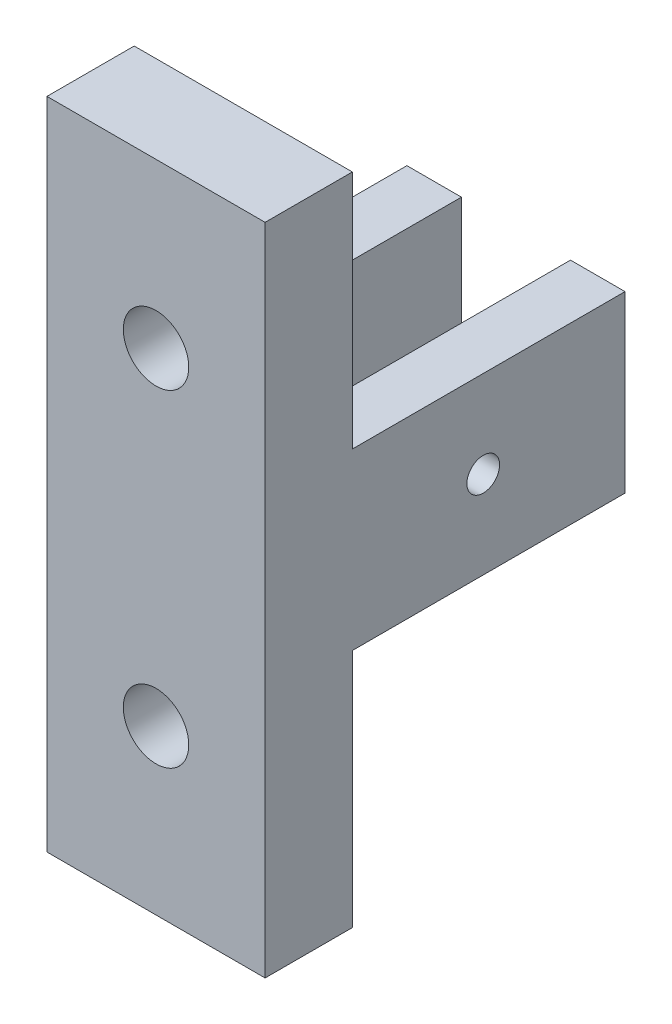
ISO-10303-21;
HEADER;
FILE_DESCRIPTION(('STEP AP214'),'2;1');
FILE_NAME('part.step','',(''),(''),'','','');
FILE_SCHEMA(('AUTOMOTIVE_DESIGN { 1 0 10303 214 1 1 1 1 }'));
ENDSEC;
DATA;
#1=APPLICATION_CONTEXT('core data for automotive mechanical design processes');
#2=APPLICATION_PROTOCOL_DEFINITION('international standard','automotive_design',2000,#1);
#3=PRODUCT_CONTEXT('',#1,'mechanical');
#4=PRODUCT('Part','Part','',(#3));
#5=PRODUCT_RELATED_PRODUCT_CATEGORY('part','',(#4));
#6=PRODUCT_DEFINITION_FORMATION('','',#4);
#7=PRODUCT_DEFINITION_CONTEXT('part definition',#1,'design');
#8=PRODUCT_DEFINITION('design','',#6,#7);
#9=PRODUCT_DEFINITION_SHAPE('','',#8);
#10=(LENGTH_UNIT() NAMED_UNIT(*) SI_UNIT(.MILLI.,.METRE.));
#11=(NAMED_UNIT(*) PLANE_ANGLE_UNIT() SI_UNIT($,.RADIAN.));
#12=(NAMED_UNIT(*) SI_UNIT($,.STERADIAN.) SOLID_ANGLE_UNIT());
#13=UNCERTAINTY_MEASURE_WITH_UNIT(LENGTH_MEASURE(1.E-05),#10,'distance_accuracy_value','');
#14=(GEOMETRIC_REPRESENTATION_CONTEXT(3) GLOBAL_UNCERTAINTY_ASSIGNED_CONTEXT((#13)) GLOBAL_UNIT_ASSIGNED_CONTEXT((#10,
#11,#12)) REPRESENTATION_CONTEXT('',''));
#15=CARTESIAN_POINT('',(0.,0.,0.));
#16=DIRECTION('',(0.,0.,1.));
#17=DIRECTION('',(1.,0.,0.));
#18=AXIS2_PLACEMENT_3D('',#15,#16,#17);
#19=CARTESIAN_POINT('',(0.,0.,0.));
#20=DIRECTION('',(0.,0.,-1.));
#21=DIRECTION('',(-1.,0.,0.));
#22=AXIS2_PLACEMENT_3D('',#19,#20,#21);
#23=PLANE('',#22);
#24=CARTESIAN_POINT('',(0.,-15.,0.));
#25=DIRECTION('',(0.,0.,1.));
#26=DIRECTION('',(1.,0.,0.));
#27=AXIS2_PLACEMENT_3D('',#24,#25,#26);
#28=CIRCLE('',#27,3.);
#29=CARTESIAN_POINT('',(3.,-15.,0.));
#30=VERTEX_POINT('',#29);
#31=EDGE_CURVE('E227',#30,#30,#28,.T.);
#32=ORIENTED_EDGE('',*,*,#31,.T.);
#33=EDGE_LOOP('',(#32));
#34=FACE_BOUND('',#33,.T.);
#35=CARTESIAN_POINT('',(0.,15.,0.));
#36=DIRECTION('',(0.,0.,1.));
#37=DIRECTION('',(1.,0.,0.));
#38=AXIS2_PLACEMENT_3D('',#35,#36,#37);
#39=CIRCLE('',#38,3.);
#40=CARTESIAN_POINT('',(3.,15.,0.));
#41=VERTEX_POINT('',#40);
#42=EDGE_CURVE('E233',#41,#41,#39,.T.);
#43=ORIENTED_EDGE('',*,*,#42,.T.);
#44=EDGE_LOOP('',(#43));
#45=FACE_BOUND('',#44,.T.);
#46=DIRECTION('',(0.,1.,0.));
#47=VECTOR('',#46,1.);
#48=CARTESIAN_POINT('',(5.,8.,0.));
#49=LINE('',#48,#47);
#50=CARTESIAN_POINT('',(5.,-8.,0.));
#51=VERTEX_POINT('',#50);
#52=CARTESIAN_POINT('',(5.,8.,0.));
#53=VERTEX_POINT('',#52);
#54=EDGE_CURVE('E252',#51,#53,#49,.T.);
#55=ORIENTED_EDGE('',*,*,#54,.F.);
#56=DIRECTION('',(-1.,0.,0.));
#57=VECTOR('',#56,1.);
#58=CARTESIAN_POINT('',(5.,-8.,0.));
#59=LINE('',#58,#57);
#60=CARTESIAN_POINT('',(10.,-8.,0.));
#61=VERTEX_POINT('',#60);
#62=EDGE_CURVE('E147',#61,#51,#59,.T.);
#63=ORIENTED_EDGE('',*,*,#62,.F.);
#64=DIRECTION('',(0.,1.,0.));
#65=VECTOR('',#64,1.);
#66=CARTESIAN_POINT('',(10.,-30.,0.));
#67=LINE('',#66,#65);
#68=CARTESIAN_POINT('',(10.,-30.,0.));
#69=VERTEX_POINT('',#68);
#70=EDGE_CURVE('E246',#69,#61,#67,.T.);
#71=ORIENTED_EDGE('',*,*,#70,.F.);
#72=DIRECTION('',(1.,0.,0.));
#73=VECTOR('',#72,1.);
#74=CARTESIAN_POINT('',(-10.,-30.,0.));
#75=LINE('',#74,#73);
#76=CARTESIAN_POINT('',(-10.,-30.,0.));
#77=VERTEX_POINT('',#76);
#78=EDGE_CURVE('E202',#77,#69,#75,.T.);
#79=ORIENTED_EDGE('',*,*,#78,.F.);
#80=DIRECTION('',(0.,-1.,0.));
#81=VECTOR('',#80,1.);
#82=CARTESIAN_POINT('',(-10.,-30.,0.));
#83=LINE('',#82,#81);
#84=CARTESIAN_POINT('',(-10.,-8.,0.));
#85=VERTEX_POINT('',#84);
#86=EDGE_CURVE('E193',#85,#77,#83,.T.);
#87=ORIENTED_EDGE('',*,*,#86,.F.);
#88=DIRECTION('',(-1.,0.,0.));
#89=VECTOR('',#88,1.);
#90=CARTESIAN_POINT('',(-5.,-8.,0.));
#91=LINE('',#90,#89);
#92=CARTESIAN_POINT('',(-5.,-8.,0.));
#93=VERTEX_POINT('',#92);
#94=EDGE_CURVE('E160',#93,#85,#91,.T.);
#95=ORIENTED_EDGE('',*,*,#94,.F.);
#96=DIRECTION('',(0.,-1.,0.));
#97=VECTOR('',#96,1.);
#98=CARTESIAN_POINT('',(-5.,-6.,0.));
#99=LINE('',#98,#97);
#100=CARTESIAN_POINT('',(-5.,8.,0.));
#101=VERTEX_POINT('',#100);
#102=EDGE_CURVE('E59',#101,#93,#99,.T.);
#103=ORIENTED_EDGE('',*,*,#102,.F.);
#104=DIRECTION('',(1.,0.,0.));
#105=VECTOR('',#104,1.);
#106=CARTESIAN_POINT('',(-5.,8.,0.));
#107=LINE('',#106,#105);
#108=CARTESIAN_POINT('',(-10.,8.,0.));
#109=VERTEX_POINT('',#108);
#110=EDGE_CURVE('E149',#109,#101,#107,.T.);
#111=ORIENTED_EDGE('',*,*,#110,.F.);
#112=CARTESIAN_POINT('',(-10.,30.,0.));
#113=VERTEX_POINT('',#112);
#114=EDGE_CURVE('E196',#113,#109,#83,.T.);
#115=ORIENTED_EDGE('',*,*,#114,.F.);
#116=DIRECTION('',(-1.,0.,0.));
#117=VECTOR('',#116,1.);
#118=CARTESIAN_POINT('',(-10.,30.,0.));
#119=LINE('',#118,#117);
#120=CARTESIAN_POINT('',(10.,30.,0.));
#121=VERTEX_POINT('',#120);
#122=EDGE_CURVE('E197',#121,#113,#119,.T.);
#123=ORIENTED_EDGE('',*,*,#122,.F.);
#124=CARTESIAN_POINT('',(10.,8.,0.));
#125=VERTEX_POINT('',#124);
#126=EDGE_CURVE('E238',#125,#121,#67,.T.);
#127=ORIENTED_EDGE('',*,*,#126,.F.);
#128=DIRECTION('',(1.,0.,0.));
#129=VECTOR('',#128,1.);
#130=CARTESIAN_POINT('',(10.,8.,0.));
#131=LINE('',#130,#129);
#132=EDGE_CURVE('E143',#53,#125,#131,.T.);
#133=ORIENTED_EDGE('',*,*,#132,.F.);
#134=EDGE_LOOP('',(#55,#63,#71,#79,#87,#95,#103,#111,#115,#123,#127,#133));
#135=FACE_BOUND('',#134,.T.);
#136=ADVANCED_FACE('F34',(#34,#45,#135),#23,.T.);
#137=CARTESIAN_POINT('',(0.,0.,8.));
#138=DIRECTION('',(0.,0.,-1.));
#139=DIRECTION('',(-1.,0.,0.));
#140=AXIS2_PLACEMENT_3D('',#137,#138,#139);
#141=PLANE('',#140);
#142=CARTESIAN_POINT('',(0.,15.,8.));
#143=DIRECTION('',(0.,0.,1.));
#144=DIRECTION('',(1.,0.,0.));
#145=AXIS2_PLACEMENT_3D('',#142,#143,#144);
#146=CIRCLE('',#145,3.);
#147=CARTESIAN_POINT('',(3.,15.,8.));
#148=VERTEX_POINT('',#147);
#149=EDGE_CURVE('E235',#148,#148,#146,.T.);
#150=ORIENTED_EDGE('',*,*,#149,.F.);
#151=EDGE_LOOP('',(#150));
#152=FACE_BOUND('',#151,.T.);
#153=DIRECTION('',(0.,1.,0.));
#154=VECTOR('',#153,1.);
#155=CARTESIAN_POINT('',(10.,-30.,8.));
#156=LINE('',#155,#154);
#157=CARTESIAN_POINT('',(10.,-30.,8.));
#158=VERTEX_POINT('',#157);
#159=CARTESIAN_POINT('',(10.,30.,8.));
#160=VERTEX_POINT('',#159);
#161=EDGE_CURVE('E205',#158,#160,#156,.T.);
#162=ORIENTED_EDGE('',*,*,#161,.T.);
#163=DIRECTION('',(-1.,0.,0.));
#164=VECTOR('',#163,1.);
#165=CARTESIAN_POINT('',(-10.,30.,8.));
#166=LINE('',#165,#164);
#167=CARTESIAN_POINT('',(-10.,30.,8.));
#168=VERTEX_POINT('',#167);
#169=EDGE_CURVE('E243',#160,#168,#166,.T.);
#170=ORIENTED_EDGE('',*,*,#169,.T.);
#171=DIRECTION('',(0.,-1.,0.));
#172=VECTOR('',#171,1.);
#173=CARTESIAN_POINT('',(-10.,-30.,8.));
#174=LINE('',#173,#172);
#175=CARTESIAN_POINT('',(-10.,-30.,8.));
#176=VERTEX_POINT('',#175);
#177=EDGE_CURVE('E220',#168,#176,#174,.T.);
#178=ORIENTED_EDGE('',*,*,#177,.T.);
#179=DIRECTION('',(1.,0.,0.));
#180=VECTOR('',#179,1.);
#181=CARTESIAN_POINT('',(-10.,-30.,8.));
#182=LINE('',#181,#180);
#183=EDGE_CURVE('E210',#176,#158,#182,.T.);
#184=ORIENTED_EDGE('',*,*,#183,.T.);
#185=EDGE_LOOP('',(#162,#170,#178,#184));
#186=FACE_BOUND('',#185,.T.);
#187=CARTESIAN_POINT('',(0.,-15.,8.));
#188=DIRECTION('',(0.,0.,1.));
#189=DIRECTION('',(1.,0.,0.));
#190=AXIS2_PLACEMENT_3D('',#187,#188,#189);
#191=CIRCLE('',#190,3.);
#192=CARTESIAN_POINT('',(3.,-15.,8.));
#193=VERTEX_POINT('',#192);
#194=EDGE_CURVE('E229',#193,#193,#191,.T.);
#195=ORIENTED_EDGE('',*,*,#194,.F.);
#196=EDGE_LOOP('',(#195));
#197=FACE_BOUND('',#196,.T.);
#198=ADVANCED_FACE('F290',(#152,#186,#197),#141,.F.);
#199=CARTESIAN_POINT('',(10.,-30.,8.));
#200=DIRECTION('',(-1.,0.,0.));
#201=DIRECTION('',(0.,0.,1.));
#202=AXIS2_PLACEMENT_3D('',#199,#200,#201);
#203=PLANE('',#202);
#204=CARTESIAN_POINT('',(10.,0.,-12.));
#205=DIRECTION('',(1.,0.,0.));
#206=DIRECTION('',(0.,0.,-1.));
#207=AXIS2_PLACEMENT_3D('',#204,#205,#206);
#208=CIRCLE('',#207,1.5);
#209=CARTESIAN_POINT('',(10.,0.,-13.5));
#210=VERTEX_POINT('',#209);
#211=EDGE_CURVE('E270',#210,#210,#208,.T.);
#212=ORIENTED_EDGE('',*,*,#211,.F.);
#213=EDGE_LOOP('',(#212));
#214=FACE_BOUND('',#213,.T.);
#215=ORIENTED_EDGE('',*,*,#70,.T.);
#216=DIRECTION('',(0.,0.,1.));
#217=VECTOR('',#216,1.);
#218=CARTESIAN_POINT('',(10.,-8.,-25.));
#219=LINE('',#218,#217);
#220=CARTESIAN_POINT('',(10.,-8.,-25.));
#221=VERTEX_POINT('',#220);
#222=EDGE_CURVE('E258',#221,#61,#219,.T.);
#223=ORIENTED_EDGE('',*,*,#222,.F.);
#224=DIRECTION('',(0.,-1.,0.));
#225=VECTOR('',#224,1.);
#226=CARTESIAN_POINT('',(10.,-8.,-25.));
#227=LINE('',#226,#225);
#228=CARTESIAN_POINT('',(10.,8.,-25.));
#229=VERTEX_POINT('',#228);
#230=EDGE_CURVE('E140',#229,#221,#227,.T.);
#231=ORIENTED_EDGE('',*,*,#230,.F.);
#232=DIRECTION('',(0.,0.,1.));
#233=VECTOR('',#232,1.);
#234=CARTESIAN_POINT('',(10.,8.,-25.));
#235=LINE('',#234,#233);
#236=EDGE_CURVE('E51',#229,#125,#235,.T.);
#237=ORIENTED_EDGE('',*,*,#236,.T.);
#238=ORIENTED_EDGE('',*,*,#126,.T.);
#239=DIRECTION('',(0.,0.,-1.));
#240=VECTOR('',#239,1.);
#241=CARTESIAN_POINT('',(10.,30.,8.));
#242=LINE('',#241,#240);
#243=EDGE_CURVE('E11',#160,#121,#242,.T.);
#244=ORIENTED_EDGE('',*,*,#243,.F.);
#245=ORIENTED_EDGE('',*,*,#161,.F.);
#246=DIRECTION('',(0.,0.,-1.));
#247=VECTOR('',#246,1.);
#248=CARTESIAN_POINT('',(10.,-30.,8.));
#249=LINE('',#248,#247);
#250=EDGE_CURVE('E206',#158,#69,#249,.T.);
#251=ORIENTED_EDGE('',*,*,#250,.T.);
#252=EDGE_LOOP('',(#215,#223,#231,#237,#238,#244,#245,#251));
#253=FACE_BOUND('',#252,.T.);
#254=ADVANCED_FACE('F36',(#214,#253),#203,.F.);
#255=CARTESIAN_POINT('',(-10.,30.,8.));
#256=DIRECTION('',(0.,-1.,0.));
#257=DIRECTION('',(0.,0.,-1.));
#258=AXIS2_PLACEMENT_3D('',#255,#256,#257);
#259=PLANE('',#258);
#260=ORIENTED_EDGE('',*,*,#122,.T.);
#261=DIRECTION('',(0.,0.,-1.));
#262=VECTOR('',#261,1.);
#263=CARTESIAN_POINT('',(-10.,30.,8.));
#264=LINE('',#263,#262);
#265=EDGE_CURVE('E43',#168,#113,#264,.T.);
#266=ORIENTED_EDGE('',*,*,#265,.F.);
#267=ORIENTED_EDGE('',*,*,#169,.F.);
#268=ORIENTED_EDGE('',*,*,#243,.T.);
#269=EDGE_LOOP('',(#260,#266,#267,#268));
#270=FACE_BOUND('',#269,.T.);
#271=ADVANCED_FACE('F307',(#270),#259,.F.);
#272=CARTESIAN_POINT('',(-10.,-30.,8.));
#273=DIRECTION('',(1.,0.,0.));
#274=DIRECTION('',(0.,0.,-1.));
#275=AXIS2_PLACEMENT_3D('',#272,#273,#274);
#276=PLANE('',#275);
#277=CARTESIAN_POINT('',(-10.,0.,-12.));
#278=DIRECTION('',(1.,0.,0.));
#279=DIRECTION('',(0.,0.,-1.));
#280=AXIS2_PLACEMENT_3D('',#277,#278,#279);
#281=CIRCLE('',#280,1.5);
#282=CARTESIAN_POINT('',(-10.,0.,-13.5));
#283=VERTEX_POINT('',#282);
#284=EDGE_CURVE('E261',#283,#283,#281,.T.);
#285=ORIENTED_EDGE('',*,*,#284,.T.);
#286=EDGE_LOOP('',(#285));
#287=FACE_BOUND('',#286,.T.);
#288=ORIENTED_EDGE('',*,*,#114,.T.);
#289=DIRECTION('',(0.,0.,1.));
#290=VECTOR('',#289,1.);
#291=CARTESIAN_POINT('',(-10.,8.,-25.));
#292=LINE('',#291,#290);
#293=CARTESIAN_POINT('',(-10.,8.,-25.));
#294=VERTEX_POINT('',#293);
#295=EDGE_CURVE('E166',#294,#109,#292,.T.);
#296=ORIENTED_EDGE('',*,*,#295,.F.);
#297=DIRECTION('',(0.,1.,0.));
#298=VECTOR('',#297,1.);
#299=CARTESIAN_POINT('',(-10.,-8.,-25.));
#300=LINE('',#299,#298);
#301=CARTESIAN_POINT('',(-10.,-8.,-25.));
#302=VERTEX_POINT('',#301);
#303=EDGE_CURVE('E164',#302,#294,#300,.T.);
#304=ORIENTED_EDGE('',*,*,#303,.F.);
#305=DIRECTION('',(0.,0.,1.));
#306=VECTOR('',#305,1.);
#307=CARTESIAN_POINT('',(-10.,-8.,-25.));
#308=LINE('',#307,#306);
#309=EDGE_CURVE('E178',#302,#85,#308,.T.);
#310=ORIENTED_EDGE('',*,*,#309,.T.);
#311=ORIENTED_EDGE('',*,*,#86,.T.);
#312=DIRECTION('',(0.,0.,-1.));
#313=VECTOR('',#312,1.);
#314=CARTESIAN_POINT('',(-10.,-30.,8.));
#315=LINE('',#314,#313);
#316=EDGE_CURVE('E209',#176,#77,#315,.T.);
#317=ORIENTED_EDGE('',*,*,#316,.F.);
#318=ORIENTED_EDGE('',*,*,#177,.F.);
#319=ORIENTED_EDGE('',*,*,#265,.T.);
#320=EDGE_LOOP('',(#288,#296,#304,#310,#311,#317,#318,#319));
#321=FACE_BOUND('',#320,.T.);
#322=ADVANCED_FACE('F218',(#287,#321),#276,.F.);
#323=CARTESIAN_POINT('',(-10.,-30.,8.));
#324=DIRECTION('',(0.,1.,0.));
#325=DIRECTION('',(0.,0.,1.));
#326=AXIS2_PLACEMENT_3D('',#323,#324,#325);
#327=PLANE('',#326);
#328=ORIENTED_EDGE('',*,*,#78,.T.);
#329=ORIENTED_EDGE('',*,*,#250,.F.);
#330=ORIENTED_EDGE('',*,*,#183,.F.);
#331=ORIENTED_EDGE('',*,*,#316,.T.);
#332=EDGE_LOOP('',(#328,#329,#330,#331));
#333=FACE_BOUND('',#332,.T.);
#334=ADVANCED_FACE('F301',(#333),#327,.F.);
#335=CARTESIAN_POINT('',(0.,15.,8.));
#336=DIRECTION('',(0.,0.,-1.));
#337=DIRECTION('',(-1.,0.,0.));
#338=AXIS2_PLACEMENT_3D('',#335,#336,#337);
#339=CYLINDRICAL_SURFACE('',#338,3.);
#340=ORIENTED_EDGE('',*,*,#149,.T.);
#341=EDGE_LOOP('',(#340));
#342=FACE_BOUND('',#341,.T.);
#343=ORIENTED_EDGE('',*,*,#42,.F.);
#344=EDGE_LOOP('',(#343));
#345=FACE_BOUND('',#344,.T.);
#346=ADVANCED_FACE('F304',(#342,#345),#339,.F.);
#347=CARTESIAN_POINT('',(0.,-15.,8.));
#348=DIRECTION('',(0.,0.,-1.));
#349=DIRECTION('',(-1.,0.,0.));
#350=AXIS2_PLACEMENT_3D('',#347,#348,#349);
#351=CYLINDRICAL_SURFACE('',#350,3.);
#352=ORIENTED_EDGE('',*,*,#194,.T.);
#353=EDGE_LOOP('',(#352));
#354=FACE_BOUND('',#353,.T.);
#355=ORIENTED_EDGE('',*,*,#31,.F.);
#356=EDGE_LOOP('',(#355));
#357=FACE_BOUND('',#356,.T.);
#358=ADVANCED_FACE('F340',(#354,#357),#351,.F.);
#359=CARTESIAN_POINT('',(-5.,8.,-25.));
#360=DIRECTION('',(0.,-1.,0.));
#361=DIRECTION('',(0.,0.,-1.));
#362=AXIS2_PLACEMENT_3D('',#359,#360,#361);
#363=PLANE('',#362);
#364=ORIENTED_EDGE('',*,*,#110,.T.);
#365=DIRECTION('',(0.,0.,1.));
#366=VECTOR('',#365,1.);
#367=CARTESIAN_POINT('',(-5.,8.,-25.));
#368=LINE('',#367,#366);
#369=CARTESIAN_POINT('',(-5.,8.,-25.));
#370=VERTEX_POINT('',#369);
#371=EDGE_CURVE('E185',#370,#101,#368,.T.);
#372=ORIENTED_EDGE('',*,*,#371,.F.);
#373=DIRECTION('',(1.,0.,0.));
#374=VECTOR('',#373,1.);
#375=CARTESIAN_POINT('',(-5.,8.,-25.));
#376=LINE('',#375,#374);
#377=EDGE_CURVE('E156',#294,#370,#376,.T.);
#378=ORIENTED_EDGE('',*,*,#377,.F.);
#379=ORIENTED_EDGE('',*,*,#295,.T.);
#380=EDGE_LOOP('',(#364,#372,#378,#379));
#381=FACE_BOUND('',#380,.T.);
#382=ADVANCED_FACE('F225',(#381),#363,.F.);
#383=CARTESIAN_POINT('',(-5.,-6.,-25.));
#384=DIRECTION('',(-1.,0.,0.));
#385=DIRECTION('',(0.,0.,1.));
#386=AXIS2_PLACEMENT_3D('',#383,#384,#385);
#387=PLANE('',#386);
#388=CARTESIAN_POINT('',(-5.,0.,-12.));
#389=DIRECTION('',(-1.,0.,0.));
#390=DIRECTION('',(0.,0.,1.));
#391=AXIS2_PLACEMENT_3D('',#388,#389,#390);
#392=CIRCLE('',#391,1.5);
#393=CARTESIAN_POINT('',(-5.,0.,-10.5));
#394=VERTEX_POINT('',#393);
#395=EDGE_CURVE('E263',#394,#394,#392,.T.);
#396=ORIENTED_EDGE('',*,*,#395,.T.);
#397=EDGE_LOOP('',(#396));
#398=FACE_BOUND('',#397,.T.);
#399=ORIENTED_EDGE('',*,*,#102,.T.);
#400=DIRECTION('',(0.,0.,1.));
#401=VECTOR('',#400,1.);
#402=CARTESIAN_POINT('',(-5.,-8.,-25.));
#403=LINE('',#402,#401);
#404=CARTESIAN_POINT('',(-5.,-8.,-25.));
#405=VERTEX_POINT('',#404);
#406=EDGE_CURVE('E170',#405,#93,#403,.T.);
#407=ORIENTED_EDGE('',*,*,#406,.F.);
#408=DIRECTION('',(0.,-1.,0.));
#409=VECTOR('',#408,1.);
#410=CARTESIAN_POINT('',(-5.,6.,-25.));
#411=LINE('',#410,#409);
#412=EDGE_CURVE('E159',#370,#405,#411,.T.);
#413=ORIENTED_EDGE('',*,*,#412,.F.);
#414=ORIENTED_EDGE('',*,*,#371,.T.);
#415=EDGE_LOOP('',(#399,#407,#413,#414));
#416=FACE_BOUND('',#415,.T.);
#417=ADVANCED_FACE('F322',(#398,#416),#387,.F.);
#418=CARTESIAN_POINT('',(-5.,-8.,-25.));
#419=DIRECTION('',(0.,1.,0.));
#420=DIRECTION('',(0.,0.,1.));
#421=AXIS2_PLACEMENT_3D('',#418,#419,#420);
#422=PLANE('',#421);
#423=ORIENTED_EDGE('',*,*,#94,.T.);
#424=ORIENTED_EDGE('',*,*,#309,.F.);
#425=DIRECTION('',(-1.,0.,0.));
#426=VECTOR('',#425,1.);
#427=CARTESIAN_POINT('',(-5.,-8.,-25.));
#428=LINE('',#427,#426);
#429=EDGE_CURVE('E162',#405,#302,#428,.T.);
#430=ORIENTED_EDGE('',*,*,#429,.F.);
#431=ORIENTED_EDGE('',*,*,#406,.T.);
#432=EDGE_LOOP('',(#423,#424,#430,#431));
#433=FACE_BOUND('',#432,.T.);
#434=ADVANCED_FACE('F319',(#433),#422,.F.);
#435=CARTESIAN_POINT('',(0.,0.,-25.));
#436=DIRECTION('',(0.,0.,-1.));
#437=DIRECTION('',(-1.,0.,0.));
#438=AXIS2_PLACEMENT_3D('',#435,#436,#437);
#439=PLANE('',#438);
#440=ORIENTED_EDGE('',*,*,#377,.T.);
#441=ORIENTED_EDGE('',*,*,#412,.T.);
#442=ORIENTED_EDGE('',*,*,#429,.T.);
#443=ORIENTED_EDGE('',*,*,#303,.T.);
#444=EDGE_LOOP('',(#440,#441,#442,#443));
#445=FACE_BOUND('',#444,.T.);
#446=ADVANCED_FACE('F324',(#445),#439,.T.);
#447=CARTESIAN_POINT('',(5.,-8.,-25.));
#448=DIRECTION('',(0.,1.,0.));
#449=DIRECTION('',(0.,0.,1.));
#450=AXIS2_PLACEMENT_3D('',#447,#448,#449);
#451=PLANE('',#450);
#452=ORIENTED_EDGE('',*,*,#62,.T.);
#453=DIRECTION('',(0.,0.,1.));
#454=VECTOR('',#453,1.);
#455=CARTESIAN_POINT('',(5.,-8.,-25.));
#456=LINE('',#455,#454);
#457=CARTESIAN_POINT('',(5.,-8.,-25.));
#458=VERTEX_POINT('',#457);
#459=EDGE_CURVE('E129',#458,#51,#456,.T.);
#460=ORIENTED_EDGE('',*,*,#459,.F.);
#461=DIRECTION('',(-1.,0.,0.));
#462=VECTOR('',#461,1.);
#463=CARTESIAN_POINT('',(5.,-8.,-25.));
#464=LINE('',#463,#462);
#465=EDGE_CURVE('E136',#221,#458,#464,.T.);
#466=ORIENTED_EDGE('',*,*,#465,.F.);
#467=ORIENTED_EDGE('',*,*,#222,.T.);
#468=EDGE_LOOP('',(#452,#460,#466,#467));
#469=FACE_BOUND('',#468,.T.);
#470=ADVANCED_FACE('F145',(#469),#451,.F.);
#471=CARTESIAN_POINT('',(5.,8.,-25.));
#472=DIRECTION('',(1.,0.,0.));
#473=DIRECTION('',(0.,0.,-1.));
#474=AXIS2_PLACEMENT_3D('',#471,#472,#473);
#475=PLANE('',#474);
#476=CARTESIAN_POINT('',(5.,0.,-12.));
#477=DIRECTION('',(1.,0.,0.));
#478=DIRECTION('',(0.,0.,-1.));
#479=AXIS2_PLACEMENT_3D('',#476,#477,#478);
#480=CIRCLE('',#479,1.5);
#481=CARTESIAN_POINT('',(5.,0.,-13.5));
#482=VERTEX_POINT('',#481);
#483=EDGE_CURVE('E38',#482,#482,#480,.T.);
#484=ORIENTED_EDGE('',*,*,#483,.T.);
#485=EDGE_LOOP('',(#484));
#486=FACE_BOUND('',#485,.T.);
#487=ORIENTED_EDGE('',*,*,#54,.T.);
#488=DIRECTION('',(0.,0.,1.));
#489=VECTOR('',#488,1.);
#490=CARTESIAN_POINT('',(5.,8.,-25.));
#491=LINE('',#490,#489);
#492=CARTESIAN_POINT('',(5.,8.,-25.));
#493=VERTEX_POINT('',#492);
#494=EDGE_CURVE('E132',#493,#53,#491,.T.);
#495=ORIENTED_EDGE('',*,*,#494,.F.);
#496=DIRECTION('',(0.,1.,0.));
#497=VECTOR('',#496,1.);
#498=CARTESIAN_POINT('',(5.,-6.,-25.));
#499=LINE('',#498,#497);
#500=EDGE_CURVE('E125',#458,#493,#499,.T.);
#501=ORIENTED_EDGE('',*,*,#500,.F.);
#502=ORIENTED_EDGE('',*,*,#459,.T.);
#503=EDGE_LOOP('',(#487,#495,#501,#502));
#504=FACE_BOUND('',#503,.T.);
#505=ADVANCED_FACE('F127',(#486,#504),#475,.F.);
#506=CARTESIAN_POINT('',(10.,8.,-25.));
#507=DIRECTION('',(0.,-1.,0.));
#508=DIRECTION('',(0.,0.,-1.));
#509=AXIS2_PLACEMENT_3D('',#506,#507,#508);
#510=PLANE('',#509);
#511=ORIENTED_EDGE('',*,*,#132,.T.);
#512=ORIENTED_EDGE('',*,*,#236,.F.);
#513=DIRECTION('',(1.,0.,0.));
#514=VECTOR('',#513,1.);
#515=CARTESIAN_POINT('',(10.,8.,-25.));
#516=LINE('',#515,#514);
#517=EDGE_CURVE('E135',#493,#229,#516,.T.);
#518=ORIENTED_EDGE('',*,*,#517,.F.);
#519=ORIENTED_EDGE('',*,*,#494,.T.);
#520=EDGE_LOOP('',(#511,#512,#518,#519));
#521=FACE_BOUND('',#520,.T.);
#522=ADVANCED_FACE('F287',(#521),#510,.F.);
#523=CARTESIAN_POINT('',(0.,0.,-25.));
#524=DIRECTION('',(0.,0.,1.));
#525=DIRECTION('',(1.,0.,0.));
#526=AXIS2_PLACEMENT_3D('',#523,#524,#525);
#527=PLANE('',#526);
#528=ORIENTED_EDGE('',*,*,#465,.T.);
#529=ORIENTED_EDGE('',*,*,#500,.T.);
#530=ORIENTED_EDGE('',*,*,#517,.T.);
#531=ORIENTED_EDGE('',*,*,#230,.T.);
#532=EDGE_LOOP('',(#528,#529,#530,#531));
#533=FACE_BOUND('',#532,.T.);
#534=ADVANCED_FACE('F139',(#533),#527,.F.);
#535=CARTESIAN_POINT('',(-15.,0.,-12.));
#536=DIRECTION('',(1.,0.,0.));
#537=DIRECTION('',(0.,0.,-1.));
#538=AXIS2_PLACEMENT_3D('',#535,#536,#537);
#539=CYLINDRICAL_SURFACE('',#538,1.5);
#540=ORIENTED_EDGE('',*,*,#211,.T.);
#541=EDGE_LOOP('',(#540));
#542=FACE_BOUND('',#541,.T.);
#543=ORIENTED_EDGE('',*,*,#483,.F.);
#544=EDGE_LOOP('',(#543));
#545=FACE_BOUND('',#544,.T.);
#546=ADVANCED_FACE('F278',(#542,#545),#539,.F.);
#547=ORIENTED_EDGE('',*,*,#395,.F.);
#548=EDGE_LOOP('',(#547));
#549=FACE_BOUND('',#548,.T.);
#550=ORIENTED_EDGE('',*,*,#284,.F.);
#551=EDGE_LOOP('',(#550));
#552=FACE_BOUND('',#551,.T.);
#553=ADVANCED_FACE('F280',(#549,#552),#539,.F.);
#554=CLOSED_SHELL('',(#136,#198,#254,#271,#322,#334,#346,#358,#382,#417,#434,#446,#470,#505,
#522,#534,#546,#553));
#555=MANIFOLD_SOLID_BREP('B2',#554);
#556=ADVANCED_BREP_SHAPE_REPRESENTATION('',(#18,#555),#14);
#557=SHAPE_DEFINITION_REPRESENTATION(#9,#556);
ENDSEC;
END-ISO-10303-21;
